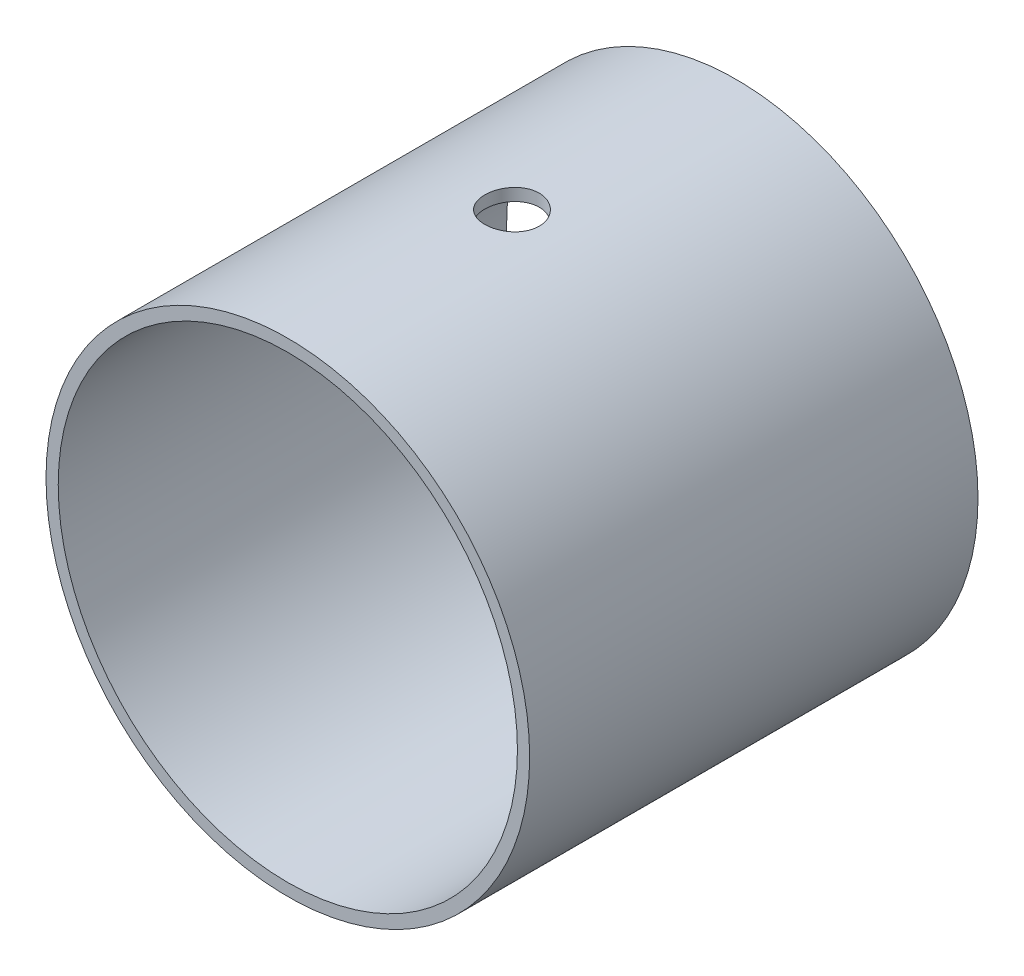
ISO-10303-21;
HEADER;
FILE_DESCRIPTION(('STEP AP214'),'2;1');
FILE_NAME('part.step','',(''),(''),'','','');
FILE_SCHEMA(('AUTOMOTIVE_DESIGN { 1 0 10303 214 1 1 1 1 }'));
ENDSEC;
DATA;
#1=APPLICATION_CONTEXT('core data for automotive mechanical design processes');
#2=APPLICATION_PROTOCOL_DEFINITION('international standard','automotive_design',2000,#1);
#3=PRODUCT_CONTEXT('',#1,'mechanical');
#4=PRODUCT('Part','Part','',(#3));
#5=PRODUCT_RELATED_PRODUCT_CATEGORY('part','',(#4));
#6=PRODUCT_DEFINITION_FORMATION('','',#4);
#7=PRODUCT_DEFINITION_CONTEXT('part definition',#1,'design');
#8=PRODUCT_DEFINITION('design','',#6,#7);
#9=PRODUCT_DEFINITION_SHAPE('','',#8);
#10=(LENGTH_UNIT() NAMED_UNIT(*) SI_UNIT(.MILLI.,.METRE.));
#11=(NAMED_UNIT(*) PLANE_ANGLE_UNIT() SI_UNIT($,.RADIAN.));
#12=(NAMED_UNIT(*) SI_UNIT($,.STERADIAN.) SOLID_ANGLE_UNIT());
#13=UNCERTAINTY_MEASURE_WITH_UNIT(LENGTH_MEASURE(1.E-05),#10,'distance_accuracy_value','');
#14=(GEOMETRIC_REPRESENTATION_CONTEXT(3) GLOBAL_UNCERTAINTY_ASSIGNED_CONTEXT((#13)) GLOBAL_UNIT_ASSIGNED_CONTEXT((#10,
#11,#12)) REPRESENTATION_CONTEXT('',''));
#15=CARTESIAN_POINT('',(0.,0.,0.));
#16=DIRECTION('',(0.,0.,1.));
#17=DIRECTION('',(1.,0.,0.));
#18=AXIS2_PLACEMENT_3D('',#15,#16,#17);
#19=CARTESIAN_POINT('',(0.,0.,16.5));
#20=DIRECTION('',(0.,0.,1.));
#21=DIRECTION('',(1.,0.,0.));
#22=AXIS2_PLACEMENT_3D('',#19,#20,#21);
#23=PLANE('',#22);
#24=CARTESIAN_POINT('',(0.,0.,16.5));
#25=DIRECTION('',(0.,0.,1.));
#26=DIRECTION('',(1.,0.,0.));
#27=AXIS2_PLACEMENT_3D('',#24,#25,#26);
#28=CIRCLE('',#27,17.8);
#29=CARTESIAN_POINT('',(17.8,0.,16.5));
#30=VERTEX_POINT('',#29);
#31=EDGE_CURVE('E10',#30,#30,#28,.T.);
#32=ORIENTED_EDGE('',*,*,#31,.T.);
#33=EDGE_LOOP('',(#32));
#34=FACE_BOUND('',#33,.T.);
#35=CARTESIAN_POINT('',(0.,0.,16.5));
#36=DIRECTION('',(0.,0.,1.));
#37=DIRECTION('',(1.,0.,0.));
#38=AXIS2_PLACEMENT_3D('',#35,#36,#37);
#39=CIRCLE('',#38,16.9);
#40=CARTESIAN_POINT('',(16.9,0.,16.5));
#41=VERTEX_POINT('',#40);
#42=EDGE_CURVE('E51',#41,#41,#39,.T.);
#43=ORIENTED_EDGE('',*,*,#42,.F.);
#44=EDGE_LOOP('',(#43));
#45=FACE_BOUND('',#44,.T.);
#46=ADVANCED_FACE('F32',(#34,#45),#23,.T.);
#47=CARTESIAN_POINT('',(0.,0.,-16.5));
#48=DIRECTION('',(0.,0.,1.));
#49=DIRECTION('',(1.,0.,0.));
#50=AXIS2_PLACEMENT_3D('',#47,#48,#49);
#51=PLANE('',#50);
#52=CARTESIAN_POINT('',(0.,0.,-16.5));
#53=DIRECTION('',(0.,0.,1.));
#54=DIRECTION('',(1.,0.,0.));
#55=AXIS2_PLACEMENT_3D('',#52,#53,#54);
#56=CIRCLE('',#55,17.8);
#57=CARTESIAN_POINT('',(17.8,0.,-16.5));
#58=VERTEX_POINT('',#57);
#59=EDGE_CURVE('E46',#58,#58,#56,.T.);
#60=ORIENTED_EDGE('',*,*,#59,.F.);
#61=EDGE_LOOP('',(#60));
#62=FACE_BOUND('',#61,.T.);
#63=CARTESIAN_POINT('',(0.,0.,-16.5));
#64=DIRECTION('',(0.,0.,1.));
#65=DIRECTION('',(1.,0.,0.));
#66=AXIS2_PLACEMENT_3D('',#63,#64,#65);
#67=CIRCLE('',#66,16.9);
#68=CARTESIAN_POINT('',(16.9,0.,-16.5));
#69=VERTEX_POINT('',#68);
#70=EDGE_CURVE('E53',#69,#69,#67,.T.);
#71=ORIENTED_EDGE('',*,*,#70,.T.);
#72=EDGE_LOOP('',(#71));
#73=FACE_BOUND('',#72,.T.);
#74=ADVANCED_FACE('F74',(#62,#73),#51,.F.);
#75=CARTESIAN_POINT('',(0.,0.,16.5));
#76=DIRECTION('',(0.,0.,-1.));
#77=DIRECTION('',(-1.,0.,0.));
#78=AXIS2_PLACEMENT_3D('',#75,#76,#77);
#79=CYLINDRICAL_SURFACE('',#78,17.8);
#80=CARTESIAN_POINT('',(0.,17.8,2.));
#81=CARTESIAN_POINT('',(-0.111962306163142,17.7999985719181,1.99999519202882));
#82=CARTESIAN_POINT('',(-0.223996743876941,17.7989324396979,1.99056665571027));
#83=CARTESIAN_POINT('',(-0.444954215214665,17.7947819588888,1.95309974200607));
#84=CARTESIAN_POINT('',(-0.553873773084645,17.7916954410325,1.92504136148197));
#85=CARTESIAN_POINT('',(-0.765370212280335,17.7838522751813,1.85114657319913));
#86=CARTESIAN_POINT('',(-0.867951081878472,17.7790966902026,1.80532147898581));
#87=CARTESIAN_POINT('',(-1.06394476667566,17.7684458187454,1.69721737587394));
#88=CARTESIAN_POINT('',(-1.15735928312498,17.7625507443586,1.63494142816089));
#89=CARTESIAN_POINT('',(-1.33280908272753,17.750250633996,1.49540387291145));
#90=CARTESIAN_POINT('',(-1.41479733389098,17.7438436517155,1.41808329475069));
#91=CARTESIAN_POINT('',(-1.56466260753295,17.7312577360403,1.25077759662501));
#92=CARTESIAN_POINT('',(-1.63253894723197,17.7250788136918,1.16079186423242));
#93=CARTESIAN_POINT('',(-1.75242459332038,17.7136291470941,0.970410124483065));
#94=CARTESIAN_POINT('',(-1.80439058235901,17.7083608988997,0.869986676664135));
#95=CARTESIAN_POINT('',(-1.8907038056509,17.6993540440215,0.661769656359563));
#96=CARTESIAN_POINT('',(-1.92505158314486,17.6956153901748,0.553976311233817));
#97=CARTESIAN_POINT('',(-1.97501216520804,17.690109170923,0.334563495008784));
#98=CARTESIAN_POINT('',(-1.99070371713307,17.6883333228267,0.222962166190547));
#99=CARTESIAN_POINT('',(-2.00314996322917,17.6869282706336,-0.00130301364459339));
#100=CARTESIAN_POINT('',(-1.999905277934,17.6872989961942,-0.113966829723376));
#101=CARTESIAN_POINT('',(-1.97463593279683,17.6901376295568,-0.336613266362746));
#102=CARTESIAN_POINT('',(-1.9526976074361,17.6925958961069,-0.446605825779034));
#103=CARTESIAN_POINT('',(-1.89079823761361,17.6993175829351,-0.661338075827419));
#104=CARTESIAN_POINT('',(-1.85083689251719,17.7035810333247,-0.766077678804702));
#105=CARTESIAN_POINT('',(-1.75393171311679,17.7134437324301,-0.967601462333491));
#106=CARTESIAN_POINT('',(-1.69694994315184,17.719045959417,-1.06436724936557));
#107=CARTESIAN_POINT('',(-1.56764861727031,17.7309525772358,-1.24699517123449));
#108=CARTESIAN_POINT('',(-1.49532849423892,17.7372569940262,-1.33285690272096));
#109=CARTESIAN_POINT('',(-1.33692290685682,17.749900570776,-1.49174083561732));
#110=CARTESIAN_POINT('',(-1.2507629488494,17.7562397284844,-1.56468878840099));
#111=CARTESIAN_POINT('',(-1.06738110474292,17.7682054910011,-1.69509773019122));
#112=CARTESIAN_POINT('',(-0.970159200755629,17.7738320946572,-1.75255869415331));
#113=CARTESIAN_POINT('',(-0.767359078061326,17.7837413634043,-1.85036098732934));
#114=CARTESIAN_POINT('',(-0.661778827136667,17.7880237003908,-1.8906981378609));
#115=CARTESIAN_POINT('',(-0.44528512277723,17.794758785148,-1.95305125705088));
#116=CARTESIAN_POINT('',(-0.334371871024655,17.7972116020492,-1.97506791797383));
#117=CARTESIAN_POINT('',(-0.111003106303353,17.8000023552387,-2.00005994131363));
#118=CARTESIAN_POINT('',(0.00144081601145245,17.8003516618515,-2.00313767825885));
#119=CARTESIAN_POINT('',(0.22524283551574,17.7989266246836,-1.99043397154816));
#120=CARTESIAN_POINT('',(0.336600951271655,17.7971523172794,-1.97465285093593));
#121=CARTESIAN_POINT('',(0.554771748936055,17.7916865897649,-1.92476438657454));
#122=CARTESIAN_POINT('',(0.661595623328209,17.7880002279454,-1.8907053882861));
#123=CARTESIAN_POINT('',(0.868014555698829,17.7791235340823,-1.80527793151764));
#124=CARTESIAN_POINT('',(0.967609411872333,17.7739331600729,-1.7539089900397));
#125=CARTESIAN_POINT('',(1.15720341296245,17.7625997423649,-1.63506883226287));
#126=CARTESIAN_POINT('',(1.24716046319244,17.7564527858883,-1.56753083871445));
#127=CARTESIAN_POINT('',(1.41449818454162,17.7439073989114,-1.41836487999214));
#128=CARTESIAN_POINT('',(1.49187845493247,17.7375089604061,-1.33673646603228));
#129=CARTESIAN_POINT('',(1.63222517394861,17.7251471266859,-1.16125808396136));
#130=CARTESIAN_POINT('',(1.69512411518243,17.7191858539071,-1.06735395285985));
#131=CARTESIAN_POINT('',(1.80425756559491,17.7084068933574,-0.870254844669217));
#132=CARTESIAN_POINT('',(1.85049235337489,17.7035891864682,-0.767060022943497));
#133=CARTESIAN_POINT('',(1.92487377569954,17.6956567172932,-0.554533959118341));
#134=CARTESIAN_POINT('',(1.9530595909686,17.6925382684669,-0.445216573157276));
#135=CARTESIAN_POINT('',(1.99066968055994,17.6883463934151,-0.223363588801904));
#136=CARTESIAN_POINT('',(2.00009464792623,17.6872728916472,-0.110828109442888));
#137=CARTESIAN_POINT('',(1.99990444334848,17.6872943464158,0.113595365340665));
#138=CARTESIAN_POINT('',(1.99039531556864,17.6883772257147,0.225483466764082));
#139=CARTESIAN_POINT('',(1.95283023064482,17.6925635802029,0.446061238889403));
#140=CARTESIAN_POINT('',(1.92477426062334,17.6956670567954,0.554750907370508));
#141=CARTESIAN_POINT('',(1.8509430236535,17.7035413947202,0.765839486941138));
#142=CARTESIAN_POINT('',(1.80517181858111,17.708311873806,0.868239833859562));
#143=CARTESIAN_POINT('',(1.6972199894142,17.718983417285,1.06392258770161));
#144=CARTESIAN_POINT('',(1.63503931717162,17.7248844849955,1.15720496787053));
#145=CARTESIAN_POINT('',(1.49563729102913,17.7371919343052,1.33254689512537));
#146=CARTESIAN_POINT('',(1.41833683547675,17.7436008631543,1.41454337819722));
#147=CARTESIAN_POINT('',(1.25105125708863,17.7561789559422,1.56444423694867));
#148=CARTESIAN_POINT('',(1.16106312388232,17.7623480625346,1.63234525875645));
#149=CARTESIAN_POINT('',(0.97064262019797,17.7737720220447,1.75230106992706));
#150=CARTESIAN_POINT('',(0.870178682985598,17.7790239762507,1.80430599394773));
#151=CARTESIAN_POINT('',(0.661945362228123,17.7879915860949,1.89063594817842));
#152=CARTESIAN_POINT('',(0.554184227436517,17.7917089437787,1.92498057615151));
#153=CARTESIAN_POINT('',(0.371530675339098,17.7962720802331,1.96661033580524));
#154=CARTESIAN_POINT('',(0.29779890279224,17.7976633960136,1.97911394198856));
#155=CARTESIAN_POINT('',(0.149388789224947,17.7995278298165,1.99581035516596));
#156=CARTESIAN_POINT('',(0.0747104534589786,17.8000009529336,2.00000320827357));
#157=CARTESIAN_POINT('',(0.,17.8,2.));
#158=B_SPLINE_CURVE_WITH_KNOTS('',3,(#80,#81,#82,#83,#84,#85,#86,#87,#88,#89,#90,#91,#92,#93,
#94,#95,#96,#97,#98,#99,#100,#101,#102,#103,#104,#105,#106,#107,#108,#109,#110,#111,#112,#113,
#114,#115,#116,#117,#118,#119,#120,#121,#122,#123,#124,#125,#126,#127,#128,#129,#130,#131,#132,
#133,#134,#135,#136,#137,#138,#139,#140,#141,#142,#143,#144,#145,#146,#147,#148,#149,#150,#151,
#152,#153,#154,#155,#156,#157),.UNSPECIFIED.,.T.,.F.,(4,2,2,2,2,2,2,2,2,2,2,2,2,2,2,2,2,2,2,2,2,
2,2,2,2,2,2,2,2,2,2,2,2,2,2,2,2,2,4),(0.,0.335614067698991,0.67158907316924,1.00735048584882,
1.34304946378468,1.6800918030313,2.0171504456732,2.35511876340982,2.69307665959003,
3.02960292330746,3.36611815924064,3.70108760877821,4.03606264601153,4.37178992904575,
4.70752962730553,5.04514106488744,5.38275304842757,5.72044737130261,6.05812893336026,
6.39398353958578,6.72983239285676,7.06479726423587,7.39977148288646,7.73615374421041,
8.07254672143216,8.41047746275478,8.74840255408631,9.08559156805695,9.42276812570584,
9.75806157058895,10.0933552482743,10.4285720929241,10.7637899211657,11.1008108147104,
11.4379118072694,11.7760596673959,12.113831468068,12.3377820025985,12.561731294501),.UNSPECIFIED.);
#159=CARTESIAN_POINT('',(0.,17.8,2.));
#160=VERTEX_POINT('',#159);
#161=EDGE_CURVE('E56',#160,#160,#158,.T.);
#162=ORIENTED_EDGE('',*,*,#161,.T.);
#163=EDGE_LOOP('',(#162));
#164=FACE_BOUND('',#163,.T.);
#165=ORIENTED_EDGE('',*,*,#31,.F.);
#166=EDGE_LOOP('',(#165));
#167=FACE_BOUND('',#166,.T.);
#168=ORIENTED_EDGE('',*,*,#59,.T.);
#169=EDGE_LOOP('',(#168));
#170=FACE_BOUND('',#169,.T.);
#171=ADVANCED_FACE('F34',(#164,#167,#170),#79,.T.);
#172=CARTESIAN_POINT('',(0.,0.,16.5));
#173=DIRECTION('',(0.,0.,-1.));
#174=DIRECTION('',(-1.,0.,0.));
#175=AXIS2_PLACEMENT_3D('',#172,#173,#174);
#176=CYLINDRICAL_SURFACE('',#175,16.9);
#177=CARTESIAN_POINT('',(0.,16.9,2.));
#178=CARTESIAN_POINT('',(-0.11192113430913,16.8999985078559,1.99999521675269));
#179=CARTESIAN_POINT('',(-0.223913376882757,16.8988764318905,1.99057358140878));
#180=CARTESIAN_POINT('',(-0.444784808801714,16.8945081693708,1.95313568496269));
#181=CARTESIAN_POINT('',(-0.553660568089521,16.8912597297423,1.92509969982554));
#182=CARTESIAN_POINT('',(-0.76506923523256,16.8830049063291,1.85126782956673));
#183=CARTESIAN_POINT('',(-0.86760623634734,16.8779996712428,1.80548354730947));
#184=CARTESIAN_POINT('',(-1.06352067327259,16.8667887983011,1.69747932123325));
#185=CARTESIAN_POINT('',(-1.15689974778081,16.860583375797,1.63526232523061));
#186=CARTESIAN_POINT('',(-1.33233093031506,16.8476312149734,1.49582867772996));
#187=CARTESIAN_POINT('',(-1.41433112240964,16.8408822042109,1.41854691180325));
#188=CARTESIAN_POINT('',(-1.56422997473096,16.827621977062,1.25131709047649));
#189=CARTESIAN_POINT('',(-1.63212793614204,16.8211107724728,1.1613684077561));
#190=CARTESIAN_POINT('',(-1.752085885872,16.8090408317415,0.971023890931073));
#191=CARTESIAN_POINT('',(-1.80409766739656,16.8034850165978,0.87059747503092));
#192=CARTESIAN_POINT('',(-1.89049899848712,16.7939844638855,0.662358974616516));
#193=CARTESIAN_POINT('',(-1.92488914867239,16.7900396714073,0.554547141970327));
#194=CARTESIAN_POINT('',(-1.97491423342448,16.7842292488919,0.335134745971339));
#195=CARTESIAN_POINT('',(-1.9906364496081,16.7823539459211,0.223554343025677));
#196=CARTESIAN_POINT('',(-2.00314937170588,16.7808651315168,-0.000675870460008763));
#197=CARTESIAN_POINT('',(-1.99994076274568,16.7812515382296,-0.113325642151189));
#198=CARTESIAN_POINT('',(-1.97475484368343,16.7842336346016,-0.335890514911255));
#199=CARTESIAN_POINT('',(-1.95287343270058,16.7868180356505,-0.445816640813044));
#200=CARTESIAN_POINT('',(-1.89111255112411,16.7938873139281,-0.660425537096128));
#201=CARTESIAN_POINT('',(-1.85123275055282,16.7983722260002,-0.765108211306286));
#202=CARTESIAN_POINT('',(-1.75450325783463,16.8087500517711,-0.966558014266775));
#203=CARTESIAN_POINT('',(-1.69761164145248,16.8146464366852,-1.0633048262859));
#204=CARTESIAN_POINT('',(-1.56850348906478,16.8271800886874,-1.24591407938225));
#205=CARTESIAN_POINT('',(-1.49628632452755,16.8338173861565,-1.33177607382034));
#206=CARTESIAN_POINT('',(-1.33804438698878,16.8471352350651,-1.49073519963342));
#207=CARTESIAN_POINT('',(-1.25193690713681,16.8538157999167,-1.56375002143285));
#208=CARTESIAN_POINT('',(-1.0686440766363,16.8664289189918,-1.69430214170877));
#209=CARTESIAN_POINT('',(-0.971458704742693,16.8723614717806,-1.75183941050185));
#210=CARTESIAN_POINT('',(-0.768707204545591,16.8828132811669,-1.84980224418391));
#211=CARTESIAN_POINT('',(-0.663138700081925,16.8873321352523,-1.89022293675139));
#212=CARTESIAN_POINT('',(-0.44664760750672,16.8944436374033,-1.95274132948787));
#213=CARTESIAN_POINT('',(-0.33572524413624,16.8970363662478,-1.97483979806948));
#214=CARTESIAN_POINT('',(-0.11238711787519,16.8999930266956,-1.99998041964399));
#215=CARTESIAN_POINT('',(1.57066073073396E-05,16.900370225919,-2.00313601387727));
#216=CARTESIAN_POINT('',(0.223748579642155,16.8988890787497,-1.9906002748897));
#217=CARTESIAN_POINT('',(0.335078648582196,16.8970307749273,-1.97490930056235));
#218=CARTESIAN_POINT('',(0.553173131025675,16.8912957422738,-1.92522004072773));
#219=CARTESIAN_POINT('',(0.659949973674479,16.8874249472877,-1.8912755657655));
#220=CARTESIAN_POINT('',(0.866295129092392,16.878098532876,-1.80609862226869));
#221=CARTESIAN_POINT('',(0.965863220327134,16.872642864771,-1.75486562270877));
#222=CARTESIAN_POINT('',(1.15547294744103,16.8607224161376,-1.63628950973062));
#223=CARTESIAN_POINT('',(1.24546819340424,16.8542530667963,-1.56887268333133));
#224=CARTESIAN_POINT('',(1.41290630945655,16.8410440087602,-1.41994731837486));
#225=CARTESIAN_POINT('',(1.49034873445251,16.8343042904892,-1.3384382803531));
#226=CARTESIAN_POINT('',(1.63088292790156,16.8212734520551,-1.1631438642792));
#227=CARTESIAN_POINT('',(1.69389970939483,16.814984787674,-1.06929815999609));
#228=CARTESIAN_POINT('',(1.8032764978701,16.8036076663385,-0.872288452897267));
#229=CARTESIAN_POINT('',(1.84963680917328,16.7985191874568,-0.769124620371036));
#230=CARTESIAN_POINT('',(1.92426206031511,16.7901349577059,-0.556653414390968));
#231=CARTESIAN_POINT('',(1.9525699486852,16.786834954705,-0.447361300438394));
#232=CARTESIAN_POINT('',(1.99042542423927,16.7823888598874,-0.225533557018236));
#233=CARTESIAN_POINT('',(1.99997378676894,16.7812426790515,-0.112998061797173));
#234=CARTESIAN_POINT('',(2.00002594428358,16.7812364034595,0.111376193208715));
#235=CARTESIAN_POINT('',(1.99064753752112,16.7823621683488,0.22321494360167));
#236=CARTESIAN_POINT('',(1.95336111890819,16.7867426117704,0.443715126205192));
#237=CARTESIAN_POINT('',(1.92545309896841,16.7899972912323,0.552376557028644));
#238=CARTESIAN_POINT('',(1.85193528655455,16.7982646017374,0.7634262342326));
#239=CARTESIAN_POINT('',(1.80633054535417,16.8032767311026,0.865816261047511));
#240=CARTESIAN_POINT('',(1.69872550929111,16.8144950878667,1.06150884225182));
#241=CARTESIAN_POINT('',(1.63672509358462,16.8207013240665,1.15481132965487));
#242=CARTESIAN_POINT('',(1.49764981374103,16.8336549162534,1.33028311290694));
#243=CARTESIAN_POINT('',(1.42048709881652,16.8404052836827,1.41238256175462));
#244=CARTESIAN_POINT('',(1.25345914104146,16.8536596462045,1.56251432827245));
#245=CARTESIAN_POINT('',(1.1635908949768,16.8601635825857,1.63054331070739));
#246=CARTESIAN_POINT('',(0.973353651290868,16.87221653007,1.75079787051251));
#247=CARTESIAN_POINT('',(0.872949763409993,16.877762196342,1.80296855710747));
#248=CARTESIAN_POINT('',(0.664799047213194,16.8872393392191,1.88963603050016));
#249=CARTESIAN_POINT('',(0.557060432781986,16.8911725879338,1.92415223065686));
#250=CARTESIAN_POINT('',(0.373957274573161,16.8960219463918,1.96616905485808));
#251=CARTESIAN_POINT('',(0.299752258316945,16.8975065392298,1.97883768818615));
#252=CARTESIAN_POINT('',(0.150375525677934,16.8994960642303,1.99575474099161));
#253=CARTESIAN_POINT('',(0.0752038154479617,16.900001002625,2.00000321403505));
#254=CARTESIAN_POINT('',(0.,16.9,2.));
#255=B_SPLINE_CURVE_WITH_KNOTS('',3,(#177,#178,#179,#180,#181,#182,#183,#184,#185,#186,#187,
#188,#189,#190,#191,#192,#193,#194,#195,#196,#197,#198,#199,#200,#201,#202,#203,#204,#205,#206,
#207,#208,#209,#210,#211,#212,#213,#214,#215,#216,#217,#218,#219,#220,#221,#222,#223,#224,#225,
#226,#227,#228,#229,#230,#231,#232,#233,#234,#235,#236,#237,#238,#239,#240,#241,#242,#243,#244,
#245,#246,#247,#248,#249,#250,#251,#252,#253,#254),.UNSPECIFIED.,.T.,.F.,(4,2,2,2,2,2,2,2,2,2,2,
2,2,2,2,2,2,2,2,2,2,2,2,2,2,2,2,2,2,2,2,2,2,2,2,2,2,2,4),(0.,0.335488730602162,0.67133351847872,
1.00695911869458,1.34252455286194,1.6795739165629,2.01663997827539,2.35471893522351,
2.69278636825306,3.02926686919688,3.36573519264734,3.70048582239605,4.03524258962275,
4.3708312338314,4.70643364386911,5.04411355845682,5.38179412065434,5.71957074085158,
6.05733319437618,6.39307089054536,6.72880219339338,7.06354915725572,7.39830640396771,
7.73461831773832,8.07094215372138,8.40897645023867,8.74700457040373,9.08422545755423,
9.42143240681229,9.756547087755,10.0916619149958,10.426681158822,10.7617028719656,
11.0987262092268,11.4358293425014,11.7740863513916,12.1119705995611,12.3373989178388,
12.5628258020177),.UNSPECIFIED.);
#256=CARTESIAN_POINT('',(0.,16.9,2.));
#257=VERTEX_POINT('',#256);
#258=EDGE_CURVE('E37',#257,#257,#255,.T.);
#259=ORIENTED_EDGE('',*,*,#258,.F.);
#260=EDGE_LOOP('',(#259));
#261=FACE_BOUND('',#260,.T.);
#262=ORIENTED_EDGE('',*,*,#42,.T.);
#263=EDGE_LOOP('',(#262));
#264=FACE_BOUND('',#263,.T.);
#265=ORIENTED_EDGE('',*,*,#70,.F.);
#266=EDGE_LOOP('',(#265));
#267=FACE_BOUND('',#266,.T.);
#268=ADVANCED_FACE('F66',(#261,#264,#267),#176,.F.);
#269=CARTESIAN_POINT('',(0.,-8.2,0.));
#270=DIRECTION('',(0.,1.,0.));
#271=DIRECTION('',(0.,0.,1.));
#272=AXIS2_PLACEMENT_3D('',#269,#270,#271);
#273=CYLINDRICAL_SURFACE('',#272,2.);
#274=ORIENTED_EDGE('',*,*,#258,.T.);
#275=EDGE_LOOP('',(#274));
#276=FACE_BOUND('',#275,.T.);
#277=ORIENTED_EDGE('',*,*,#161,.F.);
#278=EDGE_LOOP('',(#277));
#279=FACE_BOUND('',#278,.T.);
#280=ADVANCED_FACE('F63',(#276,#279),#273,.F.);
#281=CLOSED_SHELL('',(#46,#74,#171,#268,#280));
#282=MANIFOLD_SOLID_BREP('B2',#281);
#283=ADVANCED_BREP_SHAPE_REPRESENTATION('',(#18,#282),#14);
#284=SHAPE_DEFINITION_REPRESENTATION(#9,#283);
ENDSEC;
END-ISO-10303-21;
